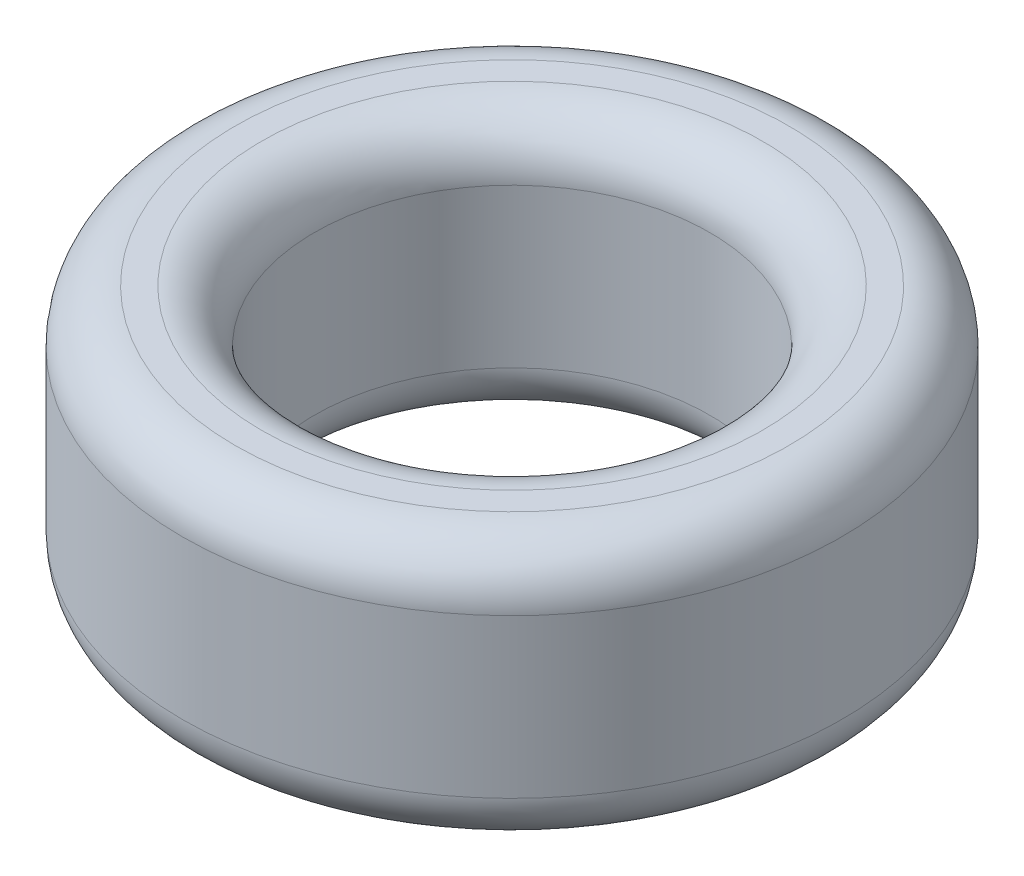
ISO-10303-21;
HEADER;
FILE_DESCRIPTION(('STEP AP214'),'2;1');
FILE_NAME('part.step','',(''),(''),'','','');
FILE_SCHEMA(('AUTOMOTIVE_DESIGN { 1 0 10303 214 1 1 1 1 }'));
ENDSEC;
DATA;
#1=APPLICATION_CONTEXT('core data for automotive mechanical design processes');
#2=APPLICATION_PROTOCOL_DEFINITION('international standard','automotive_design',2000,#1);
#3=PRODUCT_CONTEXT('',#1,'mechanical');
#4=PRODUCT('Part','Part','',(#3));
#5=PRODUCT_RELATED_PRODUCT_CATEGORY('part','',(#4));
#6=PRODUCT_DEFINITION_FORMATION('','',#4);
#7=PRODUCT_DEFINITION_CONTEXT('part definition',#1,'design');
#8=PRODUCT_DEFINITION('design','',#6,#7);
#9=PRODUCT_DEFINITION_SHAPE('','',#8);
#10=(LENGTH_UNIT() NAMED_UNIT(*) SI_UNIT(.MILLI.,.METRE.));
#11=(NAMED_UNIT(*) PLANE_ANGLE_UNIT() SI_UNIT($,.RADIAN.));
#12=(NAMED_UNIT(*) SI_UNIT($,.STERADIAN.) SOLID_ANGLE_UNIT());
#13=UNCERTAINTY_MEASURE_WITH_UNIT(LENGTH_MEASURE(1.E-05),#10,'distance_accuracy_value','');
#14=(GEOMETRIC_REPRESENTATION_CONTEXT(3) GLOBAL_UNCERTAINTY_ASSIGNED_CONTEXT((#13)) GLOBAL_UNIT_ASSIGNED_CONTEXT((#10,
#11,#12)) REPRESENTATION_CONTEXT('',''));
#15=CARTESIAN_POINT('',(0.,0.,0.));
#16=DIRECTION('',(0.,0.,1.));
#17=DIRECTION('',(1.,0.,0.));
#18=AXIS2_PLACEMENT_3D('',#15,#16,#17);
#19=CARTESIAN_POINT('',(0.,10.,0.));
#20=DIRECTION('',(0.,-1.,0.));
#21=DIRECTION('',(0.,0.,-1.));
#22=AXIS2_PLACEMENT_3D('',#19,#20,#21);
#23=CYLINDRICAL_SURFACE('',#22,12.5);
#24=CARTESIAN_POINT('',(0.,2.,0.));
#25=DIRECTION('',(0.,1.,0.));
#26=DIRECTION('',(0.,0.,1.));
#27=AXIS2_PLACEMENT_3D('',#24,#25,#26);
#28=CIRCLE('',#27,12.5);
#29=CARTESIAN_POINT('',(0.,2.,12.5));
#30=VERTEX_POINT('',#29);
#31=EDGE_CURVE('E69',#30,#30,#28,.T.);
#32=ORIENTED_EDGE('',*,*,#31,.T.);
#33=EDGE_LOOP('',(#32));
#34=FACE_BOUND('',#33,.T.);
#35=CARTESIAN_POINT('',(0.,8.,0.));
#36=DIRECTION('',(0.,1.,0.));
#37=DIRECTION('',(0.,0.,1.));
#38=AXIS2_PLACEMENT_3D('',#35,#36,#37);
#39=CIRCLE('',#38,12.5);
#40=CARTESIAN_POINT('',(0.,8.,12.5));
#41=VERTEX_POINT('',#40);
#42=EDGE_CURVE('E73',#41,#41,#39,.F.);
#43=ORIENTED_EDGE('',*,*,#42,.T.);
#44=EDGE_LOOP('',(#43));
#45=FACE_BOUND('',#44,.T.);
#46=ADVANCED_FACE('F37',(#34,#45),#23,.T.);
#47=CARTESIAN_POINT('',(0.,10.,0.));
#48=DIRECTION('',(0.,1.,0.));
#49=DIRECTION('',(0.,0.,1.));
#50=AXIS2_PLACEMENT_3D('',#47,#48,#49);
#51=PLANE('',#50);
#52=CARTESIAN_POINT('',(0.,10.,0.));
#53=DIRECTION('',(0.,1.,0.));
#54=DIRECTION('',(0.,0.,1.));
#55=AXIS2_PLACEMENT_3D('',#52,#53,#54);
#56=CIRCLE('',#55,10.5);
#57=CARTESIAN_POINT('',(0.,10.,10.5));
#58=VERTEX_POINT('',#57);
#59=EDGE_CURVE('E50',#58,#58,#56,.T.);
#60=ORIENTED_EDGE('',*,*,#59,.T.);
#61=EDGE_LOOP('',(#60));
#62=FACE_BOUND('',#61,.T.);
#63=CARTESIAN_POINT('',(0.,10.,0.));
#64=DIRECTION('',(0.,1.,0.));
#65=DIRECTION('',(0.,0.,1.));
#66=AXIS2_PLACEMENT_3D('',#63,#64,#65);
#67=CIRCLE('',#66,9.5);
#68=CARTESIAN_POINT('',(0.,10.,9.5));
#69=VERTEX_POINT('',#68);
#70=EDGE_CURVE('E55',#69,#69,#67,.F.);
#71=ORIENTED_EDGE('',*,*,#70,.T.);
#72=EDGE_LOOP('',(#71));
#73=FACE_BOUND('',#72,.T.);
#74=ADVANCED_FACE('F87',(#62,#73),#51,.T.);
#75=CARTESIAN_POINT('',(0.,0.,0.));
#76=DIRECTION('',(0.,1.,0.));
#77=DIRECTION('',(0.,0.,1.));
#78=AXIS2_PLACEMENT_3D('',#75,#76,#77);
#79=PLANE('',#78);
#80=CARTESIAN_POINT('',(0.,0.,0.));
#81=DIRECTION('',(0.,1.,0.));
#82=DIRECTION('',(0.,0.,1.));
#83=AXIS2_PLACEMENT_3D('',#80,#81,#82);
#84=CIRCLE('',#83,10.5);
#85=CARTESIAN_POINT('',(0.,0.,10.5));
#86=VERTEX_POINT('',#85);
#87=EDGE_CURVE('E61',#86,#86,#84,.F.);
#88=ORIENTED_EDGE('',*,*,#87,.T.);
#89=EDGE_LOOP('',(#88));
#90=FACE_BOUND('',#89,.T.);
#91=CARTESIAN_POINT('',(0.,0.,0.));
#92=DIRECTION('',(0.,1.,0.));
#93=DIRECTION('',(0.,0.,1.));
#94=AXIS2_PLACEMENT_3D('',#91,#92,#93);
#95=CIRCLE('',#94,9.5);
#96=CARTESIAN_POINT('',(0.,0.,9.5));
#97=VERTEX_POINT('',#96);
#98=EDGE_CURVE('E65',#97,#97,#95,.T.);
#99=ORIENTED_EDGE('',*,*,#98,.T.);
#100=EDGE_LOOP('',(#99));
#101=FACE_BOUND('',#100,.T.);
#102=ADVANCED_FACE('F90',(#90,#101),#79,.F.);
#103=CARTESIAN_POINT('',(0.,0.,0.));
#104=DIRECTION('',(0.,1.,0.));
#105=DIRECTION('',(0.,0.,1.));
#106=AXIS2_PLACEMENT_3D('',#103,#104,#105);
#107=CYLINDRICAL_SURFACE('',#106,7.5);
#108=CARTESIAN_POINT('',(0.,2.,0.));
#109=DIRECTION('',(0.,1.,0.));
#110=DIRECTION('',(0.,0.,1.));
#111=AXIS2_PLACEMENT_3D('',#108,#109,#110);
#112=CIRCLE('',#111,7.5);
#113=CARTESIAN_POINT('',(0.,2.,7.5));
#114=VERTEX_POINT('',#113);
#115=EDGE_CURVE('E10',#114,#114,#112,.F.);
#116=ORIENTED_EDGE('',*,*,#115,.T.);
#117=EDGE_LOOP('',(#116));
#118=FACE_BOUND('',#117,.T.);
#119=CARTESIAN_POINT('',(0.,8.,0.));
#120=DIRECTION('',(0.,1.,0.));
#121=DIRECTION('',(0.,0.,1.));
#122=AXIS2_PLACEMENT_3D('',#119,#120,#121);
#123=CIRCLE('',#122,7.5);
#124=CARTESIAN_POINT('',(0.,8.,7.5));
#125=VERTEX_POINT('',#124);
#126=EDGE_CURVE('E45',#125,#125,#123,.T.);
#127=ORIENTED_EDGE('',*,*,#126,.T.);
#128=EDGE_LOOP('',(#127));
#129=FACE_BOUND('',#128,.T.);
#130=ADVANCED_FACE('F108',(#118,#129),#107,.F.);
#131=CARTESIAN_POINT('',(0.,2.,0.));
#132=DIRECTION('',(0.,1.,0.));
#133=DIRECTION('',(0.,0.,1.));
#134=AXIS2_PLACEMENT_3D('',#131,#132,#133);
#135=TOROIDAL_SURFACE('',#134,10.5,2.);
#136=ORIENTED_EDGE('',*,*,#87,.F.);
#137=EDGE_LOOP('',(#136));
#138=FACE_BOUND('',#137,.T.);
#139=ORIENTED_EDGE('',*,*,#31,.F.);
#140=EDGE_LOOP('',(#139));
#141=FACE_BOUND('',#140,.T.);
#142=ADVANCED_FACE('F83',(#138,#141),#135,.T.);
#143=CARTESIAN_POINT('',(0.,8.,0.));
#144=DIRECTION('',(0.,1.,0.));
#145=DIRECTION('',(0.,0.,1.));
#146=AXIS2_PLACEMENT_3D('',#143,#144,#145);
#147=TOROIDAL_SURFACE('',#146,10.5,2.);
#148=ORIENTED_EDGE('',*,*,#42,.F.);
#149=EDGE_LOOP('',(#148));
#150=FACE_BOUND('',#149,.T.);
#151=ORIENTED_EDGE('',*,*,#59,.F.);
#152=EDGE_LOOP('',(#151));
#153=FACE_BOUND('',#152,.T.);
#154=ADVANCED_FACE('F79',(#150,#153),#147,.T.);
#155=CARTESIAN_POINT('',(0.,2.,0.));
#156=DIRECTION('',(0.,1.,0.));
#157=DIRECTION('',(0.,0.,1.));
#158=AXIS2_PLACEMENT_3D('',#155,#156,#157);
#159=TOROIDAL_SURFACE('',#158,9.5,2.);
#160=ORIENTED_EDGE('',*,*,#115,.F.);
#161=EDGE_LOOP('',(#160));
#162=FACE_BOUND('',#161,.T.);
#163=ORIENTED_EDGE('',*,*,#98,.F.);
#164=EDGE_LOOP('',(#163));
#165=FACE_BOUND('',#164,.T.);
#166=ADVANCED_FACE('F82',(#162,#165),#159,.T.);
#167=CARTESIAN_POINT('',(0.,8.,0.));
#168=DIRECTION('',(0.,1.,0.));
#169=DIRECTION('',(0.,0.,1.));
#170=AXIS2_PLACEMENT_3D('',#167,#168,#169);
#171=TOROIDAL_SURFACE('',#170,9.5,2.);
#172=ORIENTED_EDGE('',*,*,#70,.F.);
#173=EDGE_LOOP('',(#172));
#174=FACE_BOUND('',#173,.T.);
#175=ORIENTED_EDGE('',*,*,#126,.F.);
#176=EDGE_LOOP('',(#175));
#177=FACE_BOUND('',#176,.T.);
#178=ADVANCED_FACE('F39',(#174,#177),#171,.T.);
#179=CLOSED_SHELL('',(#46,#74,#102,#130,#142,#154,#166,#178));
#180=MANIFOLD_SOLID_BREP('B2',#179);
#181=ADVANCED_BREP_SHAPE_REPRESENTATION('',(#18,#180),#14);
#182=SHAPE_DEFINITION_REPRESENTATION(#9,#181);
ENDSEC;
END-ISO-10303-21;
